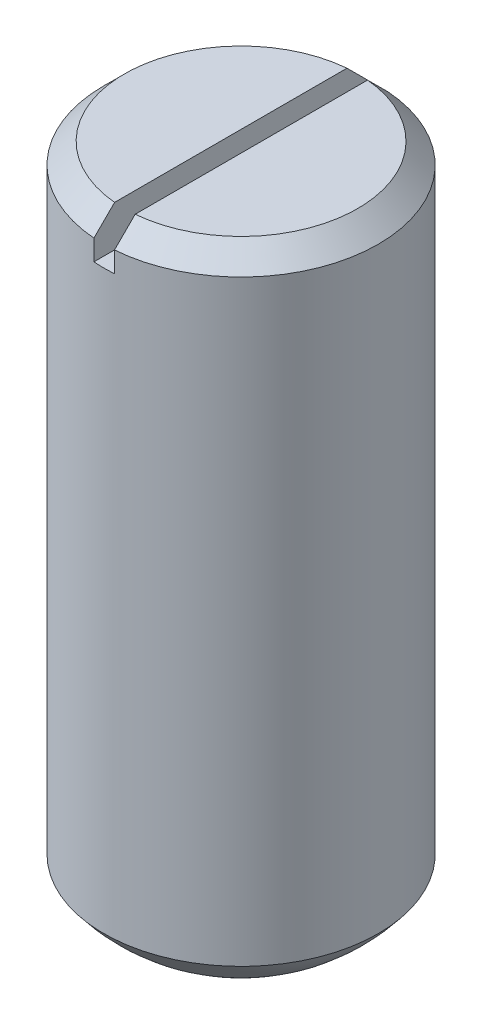
ISO-10303-21;
HEADER;
FILE_DESCRIPTION(('STEP AP214'),'2;1');
FILE_NAME('part.step','',(''),(''),'','','');
FILE_SCHEMA(('AUTOMOTIVE_DESIGN { 1 0 10303 214 1 1 1 1 }'));
ENDSEC;
DATA;
#1=APPLICATION_CONTEXT('core data for automotive mechanical design processes');
#2=APPLICATION_PROTOCOL_DEFINITION('international standard','automotive_design',2000,#1);
#3=PRODUCT_CONTEXT('',#1,'mechanical');
#4=PRODUCT('Part','Part','',(#3));
#5=PRODUCT_RELATED_PRODUCT_CATEGORY('part','',(#4));
#6=PRODUCT_DEFINITION_FORMATION('','',#4);
#7=PRODUCT_DEFINITION_CONTEXT('part definition',#1,'design');
#8=PRODUCT_DEFINITION('design','',#6,#7);
#9=PRODUCT_DEFINITION_SHAPE('','',#8);
#10=(LENGTH_UNIT() NAMED_UNIT(*) SI_UNIT(.MILLI.,.METRE.));
#11=(NAMED_UNIT(*) PLANE_ANGLE_UNIT() SI_UNIT($,.RADIAN.));
#12=(NAMED_UNIT(*) SI_UNIT($,.STERADIAN.) SOLID_ANGLE_UNIT());
#13=UNCERTAINTY_MEASURE_WITH_UNIT(LENGTH_MEASURE(1.E-05),#10,'distance_accuracy_value','');
#14=(GEOMETRIC_REPRESENTATION_CONTEXT(3) GLOBAL_UNCERTAINTY_ASSIGNED_CONTEXT((#13)) GLOBAL_UNIT_ASSIGNED_CONTEXT((#10,
#11,#12)) REPRESENTATION_CONTEXT('',''));
#15=CARTESIAN_POINT('',(0.,0.,0.));
#16=DIRECTION('',(0.,0.,1.));
#17=DIRECTION('',(1.,0.,0.));
#18=AXIS2_PLACEMENT_3D('',#15,#16,#17);
#19=CARTESIAN_POINT('',(0.,0.,0.));
#20=DIRECTION('',(0.,1.,0.));
#21=DIRECTION('',(0.,0.,1.));
#22=AXIS2_PLACEMENT_3D('',#19,#20,#21);
#23=PLANE('',#22);
#24=DIRECTION('',(0.,0.,-1.));
#25=VECTOR('',#24,1.);
#26=CARTESIAN_POINT('',(0.15,0.,2.));
#27=LINE('',#26,#25);
#28=CARTESIAN_POINT('',(0.15,0.,1.69336942218761));
#29=VERTEX_POINT('',#28);
#30=CARTESIAN_POINT('',(0.15,0.,-1.69336942218761));
#31=VERTEX_POINT('',#30);
#32=EDGE_CURVE('E136',#29,#31,#27,.T.);
#33=ORIENTED_EDGE('',*,*,#32,.F.);
#34=CARTESIAN_POINT('',(0.,0.,0.));
#35=DIRECTION('',(0.,-1.,0.));
#36=DIRECTION('',(0.,0.,-1.));
#37=AXIS2_PLACEMENT_3D('',#34,#35,#36);
#38=CIRCLE('',#37,1.7);
#39=EDGE_CURVE('E93',#31,#29,#38,.T.);
#40=ORIENTED_EDGE('',*,*,#39,.F.);
#41=EDGE_LOOP('',(#33,#40));
#42=FACE_BOUND('',#41,.T.);
#43=ADVANCED_FACE('F31',(#42),#23,.T.);
#44=CARTESIAN_POINT('',(0.,-0.300000000000001,0.));
#45=DIRECTION('',(0.,-1.,0.));
#46=DIRECTION('',(0.,0.,-1.));
#47=AXIS2_PLACEMENT_3D('',#44,#45,#46);
#48=CONICAL_SURFACE('',#47,2.,0.785398163397447);
#49=CARTESIAN_POINT('',(0.15,-2.70694053441579,4.40438700319089));
#50=CARTESIAN_POINT('',(0.15,-2.55445530085208,4.25181265169974));
#51=CARTESIAN_POINT('',(0.15,-2.40197398638432,4.09923438307277));
#52=CARTESIAN_POINT('',(0.15,-2.09702406228221,3.79406468467108));
#53=CARTESIAN_POINT('',(0.15,-1.94455545266761,3.64147325487661));
#54=CARTESIAN_POINT('',(0.15,-1.63963120066538,3.3362672985419));
#55=CARTESIAN_POINT('',(0.15,-1.48717555887756,3.18365277140234));
#56=CARTESIAN_POINT('',(0.15,-1.18229219407446,2.87839628845599));
#57=CARTESIAN_POINT('',(0.15,-1.02986447101799,2.72575433269032));
#58=CARTESIAN_POINT('',(0.15,-0.72588180542451,2.42125641588363));
#59=CARTESIAN_POINT('',(0.15,-0.574326623635115,2.26940069379387));
#60=CARTESIAN_POINT('',(0.15,-0.271295459346755,1.9656089722579));
#61=CARTESIAN_POINT('',(0.15,-0.119819477194017,1.8136729724665));
#62=CARTESIAN_POINT('',(0.15,0.182979248001441,1.5096540825237));
#63=CARTESIAN_POINT('',(0.15,0.334301994019285,1.35757119534068));
#64=CARTESIAN_POINT('',(0.15,0.560976064120345,1.12914028768295));
#65=CARTESIAN_POINT('',(0.15,0.636482143804803,1.05294582806774));
#66=CARTESIAN_POINT('',(0.15,0.787301802120616,0.900366715383624));
#67=CARTESIAN_POINT('',(0.15,0.862615381527991,0.823982063083883));
#68=CARTESIAN_POINT('',(0.15,0.978927285021813,0.705344833919061));
#69=CARTESIAN_POINT('',(0.15,1.02007740963178,0.663241116706035));
#70=CARTESIAN_POINT('',(0.15,1.10218245360956,0.578781372333444));
#71=CARTESIAN_POINT('',(0.15,1.1431372034193,0.536425179619457));
#72=CARTESIAN_POINT('',(0.15,1.21113327606188,0.465357559055472));
#73=CARTESIAN_POINT('',(0.15,1.23829824795014,0.436764467627664));
#74=CARTESIAN_POINT('',(0.15,1.29224713353768,0.379293941550784));
#75=CARTESIAN_POINT('',(0.15,1.31903153131619,0.350416965623654));
#76=CARTESIAN_POINT('',(0.15,1.3631654229126,0.301702288839711));
#77=CARTESIAN_POINT('',(0.15,1.38070375272809,0.282035882470411));
#78=CARTESIAN_POINT('',(0.15,1.41532651892816,0.24215822419257));
#79=CARTESIAN_POINT('',(0.15,1.43240881913497,0.221945081624281));
#80=CARTESIAN_POINT('',(0.15,1.45730668346165,0.190886506910296));
#81=CARTESIAN_POINT('',(0.15,1.46552003581609,0.180361871903832));
#82=CARTESIAN_POINT('',(0.15,1.4815269253154,0.158999963620038));
#83=CARTESIAN_POINT('',(0.15,1.48932061204869,0.148162803884668));
#84=CARTESIAN_POINT('',(0.15,1.50421269033476,0.12609104812879));
#85=CARTESIAN_POINT('',(0.15,1.51131426075231,0.114858626494308));
#86=CARTESIAN_POINT('',(0.15,1.5244085459423,0.0917760079117673));
#87=CARTESIAN_POINT('',(0.15,1.53040421152274,0.0799275663358877));
#88=CARTESIAN_POINT('',(0.15,1.53921970005046,0.058479762484408));
#89=CARTESIAN_POINT('',(0.15,1.54245878692143,0.0490593307032332));
#90=CARTESIAN_POINT('',(0.15,1.54734046963561,0.0298362360797612));
#91=CARTESIAN_POINT('',(0.15,1.54899074447735,0.0200356523452718));
#92=CARTESIAN_POINT('',(0.15,1.55032789151359,0.00019501748546938));
#93=CARTESIAN_POINT('',(0.15,1.5499956303327,-0.00984643267135109));
#94=CARTESIAN_POINT('',(0.15,1.54740999729014,-0.0296929366976693));
#95=CARTESIAN_POINT('',(0.15,1.54515009326043,-0.039497070068509));
#96=CARTESIAN_POINT('',(0.15,1.53770843308054,-0.0634641327843161));
#97=CARTESIAN_POINT('',(0.15,1.53162800352,-0.077332529197521));
#98=CARTESIAN_POINT('',(0.15,1.51773062923786,-0.104187096415982));
#99=CARTESIAN_POINT('',(0.15,1.509904435311,-0.1171680683171));
#100=CARTESIAN_POINT('',(0.15,1.49172794580914,-0.144938841804435));
#101=CARTESIAN_POINT('',(0.15,1.48118143554655,-0.159598016702982));
#102=CARTESIAN_POINT('',(0.15,1.459374264341,-0.18838051968167));
#103=CARTESIAN_POINT('',(0.15,1.44811298584016,-0.202503367066472));
#104=CARTESIAN_POINT('',(0.15,1.41366791872444,-0.244429715914966));
#105=CARTESIAN_POINT('',(0.15,1.38987063010639,-0.271725465375669));
#106=CARTESIAN_POINT('',(0.15,1.34155987508565,-0.325756866124515));
#107=CARTESIAN_POINT('',(0.15,1.3170450788085,-0.352491295885046));
#108=CARTESIAN_POINT('',(0.15,1.2676832795508,-0.405577203812408));
#109=CARTESIAN_POINT('',(0.15,1.24283683621822,-0.43192920085463));
#110=CARTESIAN_POINT('',(0.15,1.16843417646437,-0.510224571948922));
#111=CARTESIAN_POINT('',(0.15,1.11857801093255,-0.561881355572245));
#112=CARTESIAN_POINT('',(0.15,1.01852486041637,-0.664866033925563));
#113=CARTESIAN_POINT('',(0.15,0.968327862366145,-0.716193915898777));
#114=CARTESIAN_POINT('',(0.15,0.817409815086449,-0.869982364273887));
#115=CARTESIAN_POINT('',(0.15,0.716424229579175,-0.972183144749853));
#116=CARTESIAN_POINT('',(0.15,0.514560506547321,-1.1759852302189));
#117=CARTESIAN_POINT('',(0.15,0.41368322153717,-1.27758738304207));
#118=CARTESIAN_POINT('',(0.15,0.211820367273398,-1.48064218256816));
#119=CARTESIAN_POINT('',(0.15,0.110834824901547,-1.58209485596858));
#120=CARTESIAN_POINT('',(0.15,-0.215652913416234,-1.90987886822492));
#121=CARTESIAN_POINT('',(0.15,-0.441286812133461,-2.13607892049285));
#122=CARTESIAN_POINT('',(0.150000000000001,-0.8926900866384,-2.58838266527243));
#123=CARTESIAN_POINT('',(0.150000000000001,-1.11845947242341,-2.81448634780307));
#124=CARTESIAN_POINT('',(0.150000000000001,-1.5713387665967,-3.26791800006201));
#125=CARTESIAN_POINT('',(0.150000000000001,-1.79844901043005,-3.49524563473729));
#126=CARTESIAN_POINT('',(0.150000000000001,-2.25268464329539,-3.94984622020312));
#127=CARTESIAN_POINT('',(0.150000000000001,-2.47981002928691,-4.17711917403158));
#128=CARTESIAN_POINT('',(0.150000000000001,-2.70694053441579,-4.40438700319089));
#129=B_SPLINE_CURVE_WITH_KNOTS('',3,(#49,#50,#51,#52,#53,#54,#55,#56,#57,#58,#59,#60,#61,#62,
#63,#64,#65,#66,#67,#68,#69,#70,#71,#72,#73,#74,#75,#76,#77,#78,#79,#80,#81,#82,#83,#84,#85,#86,
#87,#88,#89,#90,#91,#92,#93,#94,#95,#96,#97,#98,#99,#100,#101,#102,#103,#104,#105,#106,#107,
#108,#109,#110,#111,#112,#113,#114,#115,#116,#117,#118,#119,#120,#121,#122,#123,#124,#125,#126,
#127,#128),.UNSPECIFIED.,.F.,.F.,(4,2,2,2,2,2,2,2,2,2,2,2,2,2,2,2,2,2,2,2,2,2,2,2,2,2,2,2,2,2,2,
2,2,2,2,2,2,2,2,4),(0.,0.64712913149623,1.29425925105192,1.94141089038902,2.58856156735365,
3.23219356725793,3.87582835769905,4.51945040253585,4.84125912845819,5.16306655502995,
5.33968598931694,5.51643789313068,5.63475662679804,5.75290822246789,5.83195745410077,
5.91132819229218,5.95137250248144,5.99140244321711,6.03123888391506,6.07096744363855,
6.1007565955523,6.13040103770316,6.16033203696282,6.19036486764267,6.23553945943647,
6.28095932786702,6.33509110082522,6.38927029749921,6.49787150165161,6.60668863353755,
6.71534088395018,6.93071231124872,7.14609204198655,7.57712116317663,8.00664780248506,
8.43608511656691,9.39457032047628,10.3531381034699,11.3171465245654,12.2810710092876),.UNSPECIFIED.);
#130=CARTESIAN_POINT('',(0.15,-0.300000000000001,1.99436706751791));
#131=VERTEX_POINT('',#130);
#132=EDGE_CURVE('E126',#131,#29,#129,.T.);
#133=ORIENTED_EDGE('',*,*,#132,.F.);
#134=CARTESIAN_POINT('',(0.,-0.300000000000001,0.));
#135=DIRECTION('',(0.,-1.,0.));
#136=DIRECTION('',(0.,0.,-1.));
#137=AXIS2_PLACEMENT_3D('',#134,#135,#136);
#138=CIRCLE('',#137,2.);
#139=CARTESIAN_POINT('',(0.15,-0.300000000000001,-1.99436706751791));
#140=VERTEX_POINT('',#139);
#141=EDGE_CURVE('E103',#140,#131,#138,.T.);
#142=ORIENTED_EDGE('',*,*,#141,.F.);
#143=EDGE_CURVE('E52',#31,#140,#129,.T.);
#144=ORIENTED_EDGE('',*,*,#143,.F.);
#145=ORIENTED_EDGE('',*,*,#39,.T.);
#146=EDGE_LOOP('',(#133,#142,#144,#145));
#147=FACE_BOUND('',#146,.T.);
#148=ADVANCED_FACE('F133',(#147),#48,.T.);
#149=DIRECTION('',(0.,0.,1.));
#150=VECTOR('',#149,1.);
#151=CARTESIAN_POINT('',(-0.15,0.,2.));
#152=LINE('',#151,#150);
#153=CARTESIAN_POINT('',(-0.15,0.,-1.69336942218761));
#154=VERTEX_POINT('',#153);
#155=CARTESIAN_POINT('',(-0.15,0.,1.69336942218761));
#156=VERTEX_POINT('',#155);
#157=EDGE_CURVE('E97',#154,#156,#152,.T.);
#158=ORIENTED_EDGE('',*,*,#157,.F.);
#159=EDGE_CURVE('E120',#156,#154,#38,.T.);
#160=ORIENTED_EDGE('',*,*,#159,.F.);
#161=EDGE_LOOP('',(#158,#160));
#162=FACE_BOUND('',#161,.T.);
#163=ADVANCED_FACE('F33',(#162),#23,.T.);
#164=CARTESIAN_POINT('',(-0.150000000000001,-2.70694053441579,-4.40438700319089));
#165=CARTESIAN_POINT('',(-0.150000000000001,-2.55445530085208,-4.25181265169974));
#166=CARTESIAN_POINT('',(-0.150000000000001,-2.40197398638432,-4.09923438307277));
#167=CARTESIAN_POINT('',(-0.150000000000001,-2.09702406228221,-3.79406468467108));
#168=CARTESIAN_POINT('',(-0.150000000000001,-1.94455545266761,-3.64147325487661));
#169=CARTESIAN_POINT('',(-0.150000000000001,-1.63963120066538,-3.3362672985419));
#170=CARTESIAN_POINT('',(-0.150000000000001,-1.48717555887756,-3.18365277140234));
#171=CARTESIAN_POINT('',(-0.150000000000001,-1.18229219407446,-2.87839628845599));
#172=CARTESIAN_POINT('',(-0.150000000000001,-1.02986447101798,-2.72575433269032));
#173=CARTESIAN_POINT('',(-0.150000000000001,-0.725881805424508,-2.42125641588363));
#174=CARTESIAN_POINT('',(-0.150000000000001,-0.574326623635113,-2.26940069379387));
#175=CARTESIAN_POINT('',(-0.15,-0.271295459346754,-1.9656089722579));
#176=CARTESIAN_POINT('',(-0.15,-0.119819477194017,-1.8136729724665));
#177=CARTESIAN_POINT('',(-0.15,0.182979248001441,-1.5096540825237));
#178=CARTESIAN_POINT('',(-0.15,0.334301994019286,-1.35757119534068));
#179=CARTESIAN_POINT('',(-0.15,0.560976064120345,-1.12914028768295));
#180=CARTESIAN_POINT('',(-0.15,0.636482143804803,-1.05294582806774));
#181=CARTESIAN_POINT('',(-0.15,0.787301802120616,-0.900366715383625));
#182=CARTESIAN_POINT('',(-0.15,0.86261538152799,-0.823982063083883));
#183=CARTESIAN_POINT('',(-0.15,0.978927285021812,-0.705344833919062));
#184=CARTESIAN_POINT('',(-0.15,1.02007740963178,-0.663241116706036));
#185=CARTESIAN_POINT('',(-0.15,1.10218245360956,-0.578781372333444));
#186=CARTESIAN_POINT('',(-0.15,1.1431372034193,-0.536425179619458));
#187=CARTESIAN_POINT('',(-0.15,1.21113327606188,-0.465357559055472));
#188=CARTESIAN_POINT('',(-0.15,1.23829824795014,-0.436764467627665));
#189=CARTESIAN_POINT('',(-0.15,1.29224713353768,-0.379293941550784));
#190=CARTESIAN_POINT('',(-0.15,1.31903153131619,-0.350416965623654));
#191=CARTESIAN_POINT('',(-0.15,1.3631654229126,-0.301702288839711));
#192=CARTESIAN_POINT('',(-0.15,1.38070375272809,-0.282035882470412));
#193=CARTESIAN_POINT('',(-0.15,1.41532651892816,-0.242158224192571));
#194=CARTESIAN_POINT('',(-0.15,1.43240881913497,-0.221945081624282));
#195=CARTESIAN_POINT('',(-0.15,1.45730668346165,-0.190886506910297));
#196=CARTESIAN_POINT('',(-0.15,1.46552003581609,-0.180361871903833));
#197=CARTESIAN_POINT('',(-0.15,1.4815269253154,-0.158999963620039));
#198=CARTESIAN_POINT('',(-0.15,1.48932061204869,-0.148162803884669));
#199=CARTESIAN_POINT('',(-0.15,1.50421269033475,-0.12609104812879));
#200=CARTESIAN_POINT('',(-0.15,1.51131426075231,-0.114858626494309));
#201=CARTESIAN_POINT('',(-0.15,1.5244085459423,-0.0917760079117678));
#202=CARTESIAN_POINT('',(-0.15,1.53040421152274,-0.0799275663358881));
#203=CARTESIAN_POINT('',(-0.15,1.53921970005046,-0.0584797624844078));
#204=CARTESIAN_POINT('',(-0.15,1.54245878692143,-0.0490593307032327));
#205=CARTESIAN_POINT('',(-0.15,1.54734046963561,-0.0298362360797607));
#206=CARTESIAN_POINT('',(-0.15,1.54899074447735,-0.0200356523452716));
#207=CARTESIAN_POINT('',(-0.15,1.55032789151359,-0.000195017485469548));
#208=CARTESIAN_POINT('',(-0.15,1.5499956303327,0.00984643267135095));
#209=CARTESIAN_POINT('',(-0.15,1.54740999729014,0.0296929366976691));
#210=CARTESIAN_POINT('',(-0.15,1.54515009326043,0.0394970700685089));
#211=CARTESIAN_POINT('',(-0.15,1.53770843308054,0.063464132784316));
#212=CARTESIAN_POINT('',(-0.15,1.53162800352,0.077332529197521));
#213=CARTESIAN_POINT('',(-0.15,1.51773062923786,0.104187096415982));
#214=CARTESIAN_POINT('',(-0.15,1.509904435311,0.1171680683171));
#215=CARTESIAN_POINT('',(-0.15,1.49172794580915,0.144938841804434));
#216=CARTESIAN_POINT('',(-0.15,1.48118143554655,0.159598016702982));
#217=CARTESIAN_POINT('',(-0.15,1.459374264341,0.188380519681669));
#218=CARTESIAN_POINT('',(-0.15,1.44811298584016,0.202503367066471));
#219=CARTESIAN_POINT('',(-0.15,1.41366791872444,0.244429715914965));
#220=CARTESIAN_POINT('',(-0.15,1.38987063010639,0.271725465375669));
#221=CARTESIAN_POINT('',(-0.15,1.34155987508565,0.325756866124515));
#222=CARTESIAN_POINT('',(-0.15,1.3170450788085,0.352491295885045));
#223=CARTESIAN_POINT('',(-0.15,1.2676832795508,0.405577203812407));
#224=CARTESIAN_POINT('',(-0.15,1.24283683621822,0.431929200854629));
#225=CARTESIAN_POINT('',(-0.15,1.16843417646437,0.510224571948921));
#226=CARTESIAN_POINT('',(-0.15,1.11857801093255,0.561881355572245));
#227=CARTESIAN_POINT('',(-0.15,1.01852486041637,0.664866033925562));
#228=CARTESIAN_POINT('',(-0.15,0.968327862366146,0.716193915898775));
#229=CARTESIAN_POINT('',(-0.15,0.817409815086451,0.869982364273885));
#230=CARTESIAN_POINT('',(-0.15,0.716424229579178,0.97218314474985));
#231=CARTESIAN_POINT('',(-0.15,0.514560506547324,1.1759852302189));
#232=CARTESIAN_POINT('',(-0.15,0.413683221537174,1.27758738304206));
#233=CARTESIAN_POINT('',(-0.15,0.211820367273402,1.48064218256816));
#234=CARTESIAN_POINT('',(-0.15,0.110834824901552,1.58209485596858));
#235=CARTESIAN_POINT('',(-0.15,-0.215652913416229,1.90987886822491));
#236=CARTESIAN_POINT('',(-0.15,-0.441286812133457,2.13607892049285));
#237=CARTESIAN_POINT('',(-0.15,-0.892690086638397,2.58838266527243));
#238=CARTESIAN_POINT('',(-0.15,-1.11845947242341,2.81448634780307));
#239=CARTESIAN_POINT('',(-0.15,-1.5713387665967,3.26791800006201));
#240=CARTESIAN_POINT('',(-0.15,-1.79844901043005,3.49524563473729));
#241=CARTESIAN_POINT('',(-0.15,-2.25268464329539,3.94984622020312));
#242=CARTESIAN_POINT('',(-0.15,-2.47981002928691,4.17711917403158));
#243=CARTESIAN_POINT('',(-0.15,-2.70694053441579,4.40438700319089));
#244=B_SPLINE_CURVE_WITH_KNOTS('',3,(#164,#165,#166,#167,#168,#169,#170,#171,#172,#173,#174,
#175,#176,#177,#178,#179,#180,#181,#182,#183,#184,#185,#186,#187,#188,#189,#190,#191,#192,#193,
#194,#195,#196,#197,#198,#199,#200,#201,#202,#203,#204,#205,#206,#207,#208,#209,#210,#211,#212,
#213,#214,#215,#216,#217,#218,#219,#220,#221,#222,#223,#224,#225,#226,#227,#228,#229,#230,#231,
#232,#233,#234,#235,#236,#237,#238,#239,#240,#241,#242,#243),.UNSPECIFIED.,.F.,.F.,(4,2,2,2,2,2,
2,2,2,2,2,2,2,2,2,2,2,2,2,2,2,2,2,2,2,2,2,2,2,2,2,2,2,2,2,2,2,2,2,4),(0.,0.647129131496231,
1.29425925105192,1.94141089038902,2.58856156735365,3.23219356725794,3.87582835769905,
4.51945040253585,4.84125912845819,5.16306655502995,5.33968598931694,5.51643789313068,
5.63475662679804,5.75290822246789,5.83195745410077,5.91132819229218,5.95137250248144,
5.99140244321711,6.03123888391506,6.07096744363855,6.1007565955523,6.13040103770317,
6.16033203696282,6.19036486764267,6.23553945943647,6.28095932786703,6.33509110082522,
6.38927029749921,6.49787150165161,6.60668863353756,6.71534088395018,6.93071231124872,
7.14609204198655,7.57712116317662,8.00664780248505,8.4360851165669,9.39457032047628,
10.3531381034699,11.3171465245654,12.2810710092876),.UNSPECIFIED.);
#245=CARTESIAN_POINT('',(-0.15,-0.300000000000001,-1.99436706751791));
#246=VERTEX_POINT('',#245);
#247=EDGE_CURVE('E110',#246,#154,#244,.T.);
#248=ORIENTED_EDGE('',*,*,#247,.F.);
#249=CARTESIAN_POINT('',(-0.15,-0.300000000000001,1.99436706751791));
#250=VERTEX_POINT('',#249);
#251=EDGE_CURVE('E118',#250,#246,#138,.T.);
#252=ORIENTED_EDGE('',*,*,#251,.F.);
#253=EDGE_CURVE('E121',#156,#250,#244,.T.);
#254=ORIENTED_EDGE('',*,*,#253,.F.);
#255=ORIENTED_EDGE('',*,*,#159,.T.);
#256=EDGE_LOOP('',(#248,#252,#254,#255));
#257=FACE_BOUND('',#256,.T.);
#258=ADVANCED_FACE('F116',(#257),#48,.T.);
#259=CARTESIAN_POINT('',(0.,0.,0.));
#260=DIRECTION('',(0.,-1.,0.));
#261=DIRECTION('',(0.,0.,-1.));
#262=AXIS2_PLACEMENT_3D('',#259,#260,#261);
#263=CYLINDRICAL_SURFACE('',#262,2.);
#264=DIRECTION('',(0.,-1.,0.));
#265=VECTOR('',#264,1.);
#266=CARTESIAN_POINT('',(0.15,0.,-1.99436706751791));
#267=LINE('',#266,#265);
#268=CARTESIAN_POINT('',(0.15,-0.6,-1.99436706751791));
#269=VERTEX_POINT('',#268);
#270=EDGE_CURVE('E11',#140,#269,#267,.T.);
#271=ORIENTED_EDGE('',*,*,#270,.F.);
#272=ORIENTED_EDGE('',*,*,#141,.T.);
#273=DIRECTION('',(0.,-1.,0.));
#274=VECTOR('',#273,1.);
#275=CARTESIAN_POINT('',(0.15,0.,1.99436706751791));
#276=LINE('',#275,#274);
#277=CARTESIAN_POINT('',(0.15,-0.6,1.99436706751791));
#278=VERTEX_POINT('',#277);
#279=EDGE_CURVE('E46',#278,#131,#276,.F.);
#280=ORIENTED_EDGE('',*,*,#279,.F.);
#281=CARTESIAN_POINT('',(0.,-0.6,0.));
#282=DIRECTION('',(0.,1.,0.));
#283=DIRECTION('',(0.,0.,1.));
#284=AXIS2_PLACEMENT_3D('',#281,#282,#283);
#285=CIRCLE('',#284,2.);
#286=CARTESIAN_POINT('',(-0.15,-0.6,1.99436706751791));
#287=VERTEX_POINT('',#286);
#288=EDGE_CURVE('E83',#278,#287,#285,.F.);
#289=ORIENTED_EDGE('',*,*,#288,.T.);
#290=DIRECTION('',(0.,-1.,0.));
#291=VECTOR('',#290,1.);
#292=CARTESIAN_POINT('',(-0.15,0.,1.99436706751791));
#293=LINE('',#292,#291);
#294=EDGE_CURVE('E92',#250,#287,#293,.T.);
#295=ORIENTED_EDGE('',*,*,#294,.F.);
#296=ORIENTED_EDGE('',*,*,#251,.T.);
#297=DIRECTION('',(0.,-1.,0.));
#298=VECTOR('',#297,1.);
#299=CARTESIAN_POINT('',(-0.15,0.,-1.99436706751791));
#300=LINE('',#299,#298);
#301=CARTESIAN_POINT('',(-0.15,-0.6,-1.99436706751791));
#302=VERTEX_POINT('',#301);
#303=EDGE_CURVE('E39',#302,#246,#300,.F.);
#304=ORIENTED_EDGE('',*,*,#303,.F.);
#305=EDGE_CURVE('E95',#302,#269,#285,.F.);
#306=ORIENTED_EDGE('',*,*,#305,.T.);
#307=EDGE_LOOP('',(#271,#272,#280,#289,#295,#296,#304,#306));
#308=FACE_BOUND('',#307,.T.);
#309=CARTESIAN_POINT('',(0.,-9.,0.));
#310=DIRECTION('',(0.,-1.,0.));
#311=DIRECTION('',(0.,0.,-1.));
#312=AXIS2_PLACEMENT_3D('',#309,#310,#311);
#313=CIRCLE('',#312,2.);
#314=CARTESIAN_POINT('',(0.,-9.,-2.));
#315=VERTEX_POINT('',#314);
#316=EDGE_CURVE('E123',#315,#315,#313,.T.);
#317=ORIENTED_EDGE('',*,*,#316,.F.);
#318=EDGE_LOOP('',(#317));
#319=FACE_BOUND('',#318,.T.);
#320=ADVANCED_FACE('F100',(#308,#319),#263,.T.);
#321=CARTESIAN_POINT('',(0.,-7.5,0.));
#322=DIRECTION('',(0.,-1.,0.));
#323=DIRECTION('',(1.,0.,0.));
#324=AXIS2_PLACEMENT_3D('',#321,#322,#323);
#325=SPHERICAL_SURFACE('',#324,2.5);
#326=ORIENTED_EDGE('',*,*,#316,.T.);
#327=EDGE_LOOP('',(#326));
#328=FACE_BOUND('',#327,.T.);
#329=ADVANCED_FACE('F156',(#328),#325,.T.);
#330=CARTESIAN_POINT('',(0.15,-0.6,2.));
#331=DIRECTION('',(1.,0.,0.));
#332=DIRECTION('',(0.,0.,-1.));
#333=AXIS2_PLACEMENT_3D('',#330,#331,#332);
#334=PLANE('',#333);
#335=ORIENTED_EDGE('',*,*,#132,.T.);
#336=ORIENTED_EDGE('',*,*,#32,.T.);
#337=ORIENTED_EDGE('',*,*,#143,.T.);
#338=ORIENTED_EDGE('',*,*,#270,.T.);
#339=DIRECTION('',(0.,0.,-1.));
#340=VECTOR('',#339,1.);
#341=CARTESIAN_POINT('',(0.15,-0.6,2.));
#342=LINE('',#341,#340);
#343=EDGE_CURVE('E85',#278,#269,#342,.T.);
#344=ORIENTED_EDGE('',*,*,#343,.F.);
#345=ORIENTED_EDGE('',*,*,#279,.T.);
#346=EDGE_LOOP('',(#335,#336,#337,#338,#344,#345));
#347=FACE_BOUND('',#346,.T.);
#348=ADVANCED_FACE('F96',(#347),#334,.F.);
#349=CARTESIAN_POINT('',(-0.15,-0.6,2.));
#350=DIRECTION('',(-1.,0.,0.));
#351=DIRECTION('',(0.,0.,1.));
#352=AXIS2_PLACEMENT_3D('',#349,#350,#351);
#353=PLANE('',#352);
#354=ORIENTED_EDGE('',*,*,#247,.T.);
#355=ORIENTED_EDGE('',*,*,#157,.T.);
#356=ORIENTED_EDGE('',*,*,#253,.T.);
#357=ORIENTED_EDGE('',*,*,#294,.T.);
#358=DIRECTION('',(0.,0.,1.));
#359=VECTOR('',#358,1.);
#360=CARTESIAN_POINT('',(-0.15,-0.6,2.));
#361=LINE('',#360,#359);
#362=EDGE_CURVE('E88',#302,#287,#361,.T.);
#363=ORIENTED_EDGE('',*,*,#362,.F.);
#364=ORIENTED_EDGE('',*,*,#303,.T.);
#365=EDGE_LOOP('',(#354,#355,#356,#357,#363,#364));
#366=FACE_BOUND('',#365,.T.);
#367=ADVANCED_FACE('F109',(#366),#353,.F.);
#368=CARTESIAN_POINT('',(0.15,-0.6,-2.));
#369=DIRECTION('',(0.,1.,0.));
#370=DIRECTION('',(0.,0.,1.));
#371=AXIS2_PLACEMENT_3D('',#368,#369,#370);
#372=PLANE('',#371);
#373=ORIENTED_EDGE('',*,*,#362,.T.);
#374=ORIENTED_EDGE('',*,*,#288,.F.);
#375=ORIENTED_EDGE('',*,*,#343,.T.);
#376=ORIENTED_EDGE('',*,*,#305,.F.);
#377=EDGE_LOOP('',(#373,#374,#375,#376));
#378=FACE_BOUND('',#377,.T.);
#379=ADVANCED_FACE('F84',(#378),#372,.T.);
#380=CLOSED_SHELL('',(#43,#148,#163,#258,#320,#329,#348,#367,#379));
#381=MANIFOLD_SOLID_BREP('B2',#380);
#382=ADVANCED_BREP_SHAPE_REPRESENTATION('',(#18,#381),#14);
#383=SHAPE_DEFINITION_REPRESENTATION(#9,#382);
ENDSEC;
END-ISO-10303-21;
